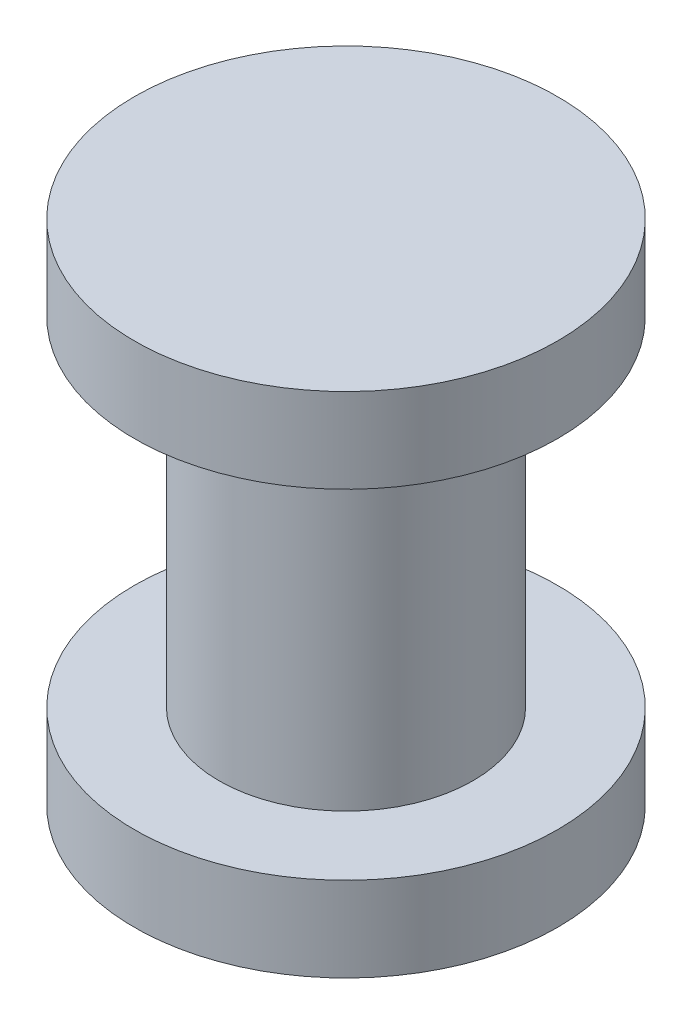
ISO-10303-21;
HEADER;
FILE_DESCRIPTION(('STEP AP214'),'2;1');
FILE_NAME('part.step','',(''),(''),'','','');
FILE_SCHEMA(('AUTOMOTIVE_DESIGN { 1 0 10303 214 1 1 1 1 }'));
ENDSEC;
DATA;
#1=APPLICATION_CONTEXT('core data for automotive mechanical design processes');
#2=APPLICATION_PROTOCOL_DEFINITION('international standard','automotive_design',2000,#1);
#3=PRODUCT_CONTEXT('',#1,'mechanical');
#4=PRODUCT('Part','Part','',(#3));
#5=PRODUCT_RELATED_PRODUCT_CATEGORY('part','',(#4));
#6=PRODUCT_DEFINITION_FORMATION('','',#4);
#7=PRODUCT_DEFINITION_CONTEXT('part definition',#1,'design');
#8=PRODUCT_DEFINITION('design','',#6,#7);
#9=PRODUCT_DEFINITION_SHAPE('','',#8);
#10=(LENGTH_UNIT() NAMED_UNIT(*) SI_UNIT(.MILLI.,.METRE.));
#11=(NAMED_UNIT(*) PLANE_ANGLE_UNIT() SI_UNIT($,.RADIAN.));
#12=(NAMED_UNIT(*) SI_UNIT($,.STERADIAN.) SOLID_ANGLE_UNIT());
#13=UNCERTAINTY_MEASURE_WITH_UNIT(LENGTH_MEASURE(1.E-05),#10,'distance_accuracy_value','');
#14=(GEOMETRIC_REPRESENTATION_CONTEXT(3) GLOBAL_UNCERTAINTY_ASSIGNED_CONTEXT((#13)) GLOBAL_UNIT_ASSIGNED_CONTEXT((#10,
#11,#12)) REPRESENTATION_CONTEXT('',''));
#15=CARTESIAN_POINT('',(0.,0.,0.));
#16=DIRECTION('',(0.,0.,1.));
#17=DIRECTION('',(1.,0.,0.));
#18=AXIS2_PLACEMENT_3D('',#15,#16,#17);
#19=CARTESIAN_POINT('',(-14.7615435905984,19.9486383621148,0.));
#20=DIRECTION('',(0.,-1.,0.));
#21=DIRECTION('',(1.,0.,0.));
#22=AXIS2_PLACEMENT_3D('',#19,#20,#21);
#23=PLANE('',#22);
#24=CARTESIAN_POINT('',(-14.7615435905984,19.9486383621148,0.));
#25=DIRECTION('',(0.,1.,0.));
#26=DIRECTION('',(-1.,0.,0.));
#27=AXIS2_PLACEMENT_3D('',#24,#25,#26);
#28=CIRCLE('',#27,2.5);
#29=CARTESIAN_POINT('',(-17.2615435905984,19.9486383621148,0.));
#30=VERTEX_POINT('',#29);
#31=EDGE_CURVE('E10',#30,#30,#28,.T.);
#32=ORIENTED_EDGE('',*,*,#31,.F.);
#33=EDGE_LOOP('',(#32));
#34=FACE_BOUND('',#33,.T.);
#35=ADVANCED_FACE('F41',(#34),#23,.T.);
#36=CARTESIAN_POINT('',(-14.7615435905984,25.9486383621148,0.));
#37=DIRECTION('',(0.,1.,0.));
#38=DIRECTION('',(-1.,0.,0.));
#39=AXIS2_PLACEMENT_3D('',#36,#37,#38);
#40=CYLINDRICAL_SURFACE('',#39,2.5);
#41=ORIENTED_EDGE('',*,*,#31,.T.);
#42=EDGE_LOOP('',(#41));
#43=FACE_BOUND('',#42,.T.);
#44=CARTESIAN_POINT('',(-14.7615435905984,20.9486383621148,0.));
#45=DIRECTION('',(0.,1.,0.));
#46=DIRECTION('',(-1.,0.,0.));
#47=AXIS2_PLACEMENT_3D('',#44,#45,#46);
#48=CIRCLE('',#47,2.5);
#49=CARTESIAN_POINT('',(-17.2615435905984,20.9486383621148,0.));
#50=VERTEX_POINT('',#49);
#51=EDGE_CURVE('E48',#50,#50,#48,.T.);
#52=ORIENTED_EDGE('',*,*,#51,.F.);
#53=EDGE_LOOP('',(#52));
#54=FACE_BOUND('',#53,.T.);
#55=ADVANCED_FACE('F89',(#43,#54),#40,.T.);
#56=CARTESIAN_POINT('',(-17.2615435905984,20.9486383621148,0.));
#57=DIRECTION('',(0.,1.,0.));
#58=DIRECTION('',(-1.,0.,0.));
#59=AXIS2_PLACEMENT_3D('',#56,#57,#58);
#60=PLANE('',#59);
#61=ORIENTED_EDGE('',*,*,#51,.T.);
#62=EDGE_LOOP('',(#61));
#63=FACE_BOUND('',#62,.T.);
#64=CARTESIAN_POINT('',(-14.7615435905984,20.9486383621148,0.));
#65=DIRECTION('',(0.,1.,0.));
#66=DIRECTION('',(-1.,0.,0.));
#67=AXIS2_PLACEMENT_3D('',#64,#65,#66);
#68=CIRCLE('',#67,1.5);
#69=CARTESIAN_POINT('',(-16.2615435905984,20.9486383621148,0.));
#70=VERTEX_POINT('',#69);
#71=EDGE_CURVE('E53',#70,#70,#68,.T.);
#72=ORIENTED_EDGE('',*,*,#71,.F.);
#73=EDGE_LOOP('',(#72));
#74=FACE_BOUND('',#73,.T.);
#75=ADVANCED_FACE('F94',(#63,#74),#60,.T.);
#76=CARTESIAN_POINT('',(-14.7615435905984,25.9486383621148,0.));
#77=DIRECTION('',(0.,1.,0.));
#78=DIRECTION('',(-1.,0.,0.));
#79=AXIS2_PLACEMENT_3D('',#76,#77,#78);
#80=CYLINDRICAL_SURFACE('',#79,1.5);
#81=ORIENTED_EDGE('',*,*,#71,.T.);
#82=EDGE_LOOP('',(#81));
#83=FACE_BOUND('',#82,.T.);
#84=CARTESIAN_POINT('',(-14.7615435905984,24.9486383621148,0.));
#85=DIRECTION('',(0.,1.,0.));
#86=DIRECTION('',(-1.,0.,0.));
#87=AXIS2_PLACEMENT_3D('',#84,#85,#86);
#88=CIRCLE('',#87,1.5);
#89=CARTESIAN_POINT('',(-16.2615435905984,24.9486383621148,0.));
#90=VERTEX_POINT('',#89);
#91=EDGE_CURVE('E58',#90,#90,#88,.T.);
#92=ORIENTED_EDGE('',*,*,#91,.F.);
#93=EDGE_LOOP('',(#92));
#94=FACE_BOUND('',#93,.T.);
#95=ADVANCED_FACE('F85',(#83,#94),#80,.T.);
#96=CARTESIAN_POINT('',(-16.2615435905984,24.9486383621148,0.));
#97=DIRECTION('',(0.,-1.,0.));
#98=DIRECTION('',(1.,0.,0.));
#99=AXIS2_PLACEMENT_3D('',#96,#97,#98);
#100=PLANE('',#99);
#101=ORIENTED_EDGE('',*,*,#91,.T.);
#102=EDGE_LOOP('',(#101));
#103=FACE_BOUND('',#102,.T.);
#104=CARTESIAN_POINT('',(-14.7615435905984,24.9486383621148,0.));
#105=DIRECTION('',(0.,1.,0.));
#106=DIRECTION('',(-1.,0.,0.));
#107=AXIS2_PLACEMENT_3D('',#104,#105,#106);
#108=CIRCLE('',#107,2.5);
#109=CARTESIAN_POINT('',(-17.2615435905984,24.9486383621148,0.));
#110=VERTEX_POINT('',#109);
#111=EDGE_CURVE('E64',#110,#110,#108,.T.);
#112=ORIENTED_EDGE('',*,*,#111,.F.);
#113=EDGE_LOOP('',(#112));
#114=FACE_BOUND('',#113,.T.);
#115=ADVANCED_FACE('F77',(#103,#114),#100,.T.);
#116=CARTESIAN_POINT('',(-14.7615435905984,25.9486383621148,0.));
#117=DIRECTION('',(0.,1.,0.));
#118=DIRECTION('',(-1.,0.,0.));
#119=AXIS2_PLACEMENT_3D('',#116,#117,#118);
#120=CYLINDRICAL_SURFACE('',#119,2.5);
#121=ORIENTED_EDGE('',*,*,#111,.T.);
#122=EDGE_LOOP('',(#121));
#123=FACE_BOUND('',#122,.T.);
#124=CARTESIAN_POINT('',(-14.7615435905984,25.9486383621148,0.));
#125=DIRECTION('',(0.,1.,0.));
#126=DIRECTION('',(-1.,0.,0.));
#127=AXIS2_PLACEMENT_3D('',#124,#125,#126);
#128=CIRCLE('',#127,2.5);
#129=CARTESIAN_POINT('',(-17.2615435905984,25.9486383621148,0.));
#130=VERTEX_POINT('',#129);
#131=EDGE_CURVE('E68',#130,#130,#128,.T.);
#132=ORIENTED_EDGE('',*,*,#131,.F.);
#133=EDGE_LOOP('',(#132));
#134=FACE_BOUND('',#133,.T.);
#135=ADVANCED_FACE('F75',(#123,#134),#120,.T.);
#136=CARTESIAN_POINT('',(-14.7615435905984,25.9486383621148,0.));
#137=DIRECTION('',(0.,1.,0.));
#138=DIRECTION('',(-1.,0.,0.));
#139=AXIS2_PLACEMENT_3D('',#136,#137,#138);
#140=PLANE('',#139);
#141=ORIENTED_EDGE('',*,*,#131,.T.);
#142=EDGE_LOOP('',(#141));
#143=FACE_BOUND('',#142,.T.);
#144=ADVANCED_FACE('F73',(#143),#140,.T.);
#145=CLOSED_SHELL('',(#35,#55,#75,#95,#115,#135,#144));
#146=MANIFOLD_SOLID_BREP('B2',#145);
#147=ADVANCED_BREP_SHAPE_REPRESENTATION('',(#18,#146),#14);
#148=SHAPE_DEFINITION_REPRESENTATION(#9,#147);
ENDSEC;
END-ISO-10303-21;
